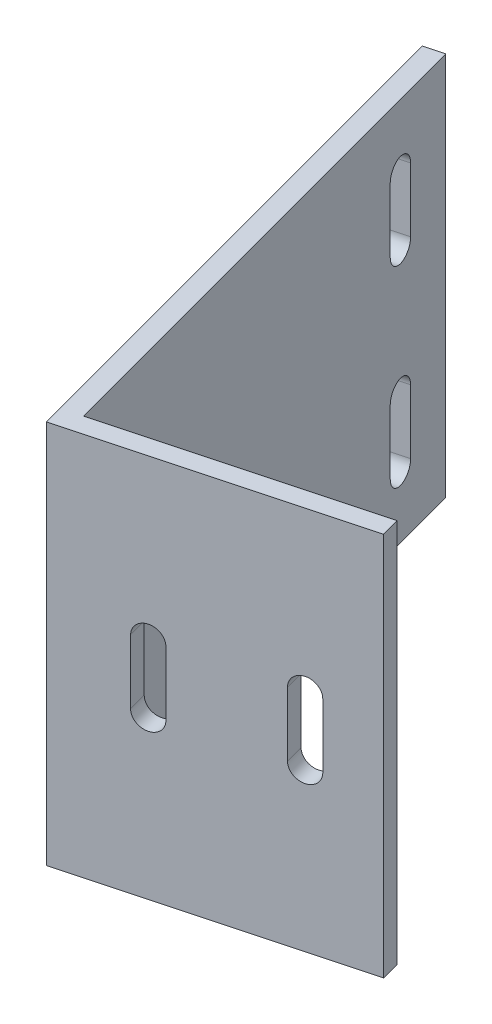
ISO-10303-21;
HEADER;
FILE_DESCRIPTION(('STEP AP214'),'2;1');
FILE_NAME('part.step','',(''),(''),'','','');
FILE_SCHEMA(('AUTOMOTIVE_DESIGN { 1 0 10303 214 1 1 1 1 }'));
ENDSEC;
DATA;
#1=APPLICATION_CONTEXT('core data for automotive mechanical design processes');
#2=APPLICATION_PROTOCOL_DEFINITION('international standard','automotive_design',2000,#1);
#3=PRODUCT_CONTEXT('',#1,'mechanical');
#4=PRODUCT('Part','Part','',(#3));
#5=PRODUCT_RELATED_PRODUCT_CATEGORY('part','',(#4));
#6=PRODUCT_DEFINITION_FORMATION('','',#4);
#7=PRODUCT_DEFINITION_CONTEXT('part definition',#1,'design');
#8=PRODUCT_DEFINITION('design','',#6,#7);
#9=PRODUCT_DEFINITION_SHAPE('','',#8);
#10=(LENGTH_UNIT() NAMED_UNIT(*) SI_UNIT(.MILLI.,.METRE.));
#11=(NAMED_UNIT(*) PLANE_ANGLE_UNIT() SI_UNIT($,.RADIAN.));
#12=(NAMED_UNIT(*) SI_UNIT($,.STERADIAN.) SOLID_ANGLE_UNIT());
#13=UNCERTAINTY_MEASURE_WITH_UNIT(LENGTH_MEASURE(1.E-05),#10,'distance_accuracy_value','');
#14=(GEOMETRIC_REPRESENTATION_CONTEXT(3) GLOBAL_UNCERTAINTY_ASSIGNED_CONTEXT((#13)) GLOBAL_UNIT_ASSIGNED_CONTEXT((#10,
#11,#12)) REPRESENTATION_CONTEXT('',''));
#15=CARTESIAN_POINT('',(0.,0.,0.));
#16=DIRECTION('',(0.,0.,1.));
#17=DIRECTION('',(1.,0.,0.));
#18=AXIS2_PLACEMENT_3D('',#15,#16,#17);
#19=CARTESIAN_POINT('',(-971.5373896003,-1784.,2948.593377713));
#20=DIRECTION('',(0.965925826288944,0.,-0.258819045102985));
#21=DIRECTION('',(0.,-1.,0.));
#22=AXIS2_PLACEMENT_3D('',#19,#20,#21);
#23=PLANE('',#22);
#24=DIRECTION('',(0.258819045102985,0.,0.965925826288944));
#25=VECTOR('',#24,1.);
#26=CARTESIAN_POINT('',(-971.5373896003,-1804.,2948.593377713));
#27=LINE('',#26,#25);
#28=CARTESIAN_POINT('',(-971.5115076958,-1804.,2948.689970295));
#29=VERTEX_POINT('',#28);
#30=CARTESIAN_POINT('',(-969.9585934252,-1804.,2954.485525253));
#31=VERTEX_POINT('',#30);
#32=EDGE_CURVE('E11',#29,#31,#27,.T.);
#33=ORIENTED_EDGE('',*,*,#32,.T.);
#34=DIRECTION('',(0.,1.,0.));
#35=VECTOR('',#34,1.);
#36=CARTESIAN_POINT('',(-969.9585934252,-1819.,2954.485525253));
#37=LINE('',#36,#35);
#38=CARTESIAN_POINT('',(-969.9585934252,-1784.,2954.485525253));
#39=VERTEX_POINT('',#38);
#40=EDGE_CURVE('E411',#31,#39,#37,.T.);
#41=ORIENTED_EDGE('',*,*,#40,.T.);
#42=DIRECTION('',(0.258819045102985,0.,0.965925826288944));
#43=VECTOR('',#42,1.);
#44=CARTESIAN_POINT('',(-971.5373896003,-1784.,2948.593377713));
#45=LINE('',#44,#43);
#46=CARTESIAN_POINT('',(-971.5115076958,-1784.,2948.689970295));
#47=VERTEX_POINT('',#46);
#48=EDGE_CURVE('E25',#47,#39,#45,.T.);
#49=ORIENTED_EDGE('',*,*,#48,.F.);
#50=DIRECTION('',(0.,1.,0.));
#51=VECTOR('',#50,1.);
#52=CARTESIAN_POINT('',(-971.5115076958,-1819.,2948.689970295));
#53=LINE('',#52,#51);
#54=EDGE_CURVE('E331',#29,#47,#53,.T.);
#55=ORIENTED_EDGE('',*,*,#54,.F.);
#56=EDGE_LOOP('',(#33,#41,#49,#55));
#57=FACE_BOUND('',#56,.T.);
#58=ADVANCED_FACE('F17',(#57),#23,.F.);
#59=CARTESIAN_POINT('',(-975.8840558186,-1804.,2949.758063416));
#60=DIRECTION('',(-0.258819045102985,0.,-0.965925826288944));
#61=DIRECTION('',(0.965925826288944,0.,-0.258819045102985));
#62=AXIS2_PLACEMENT_3D('',#59,#60,#61);
#63=CYLINDRICAL_SURFACE('',#62,4.5);
#64=DIRECTION('',(0.258819045102985,0.,0.965925826288944));
#65=VECTOR('',#64,1.);
#66=CARTESIAN_POINT('',(-980.2307220369,-1804.,2950.922749119));
#67=LINE('',#66,#65);
#68=CARTESIAN_POINT('',(-980.2048401324,-1804.,2951.019341701));
#69=VERTEX_POINT('',#68);
#70=CARTESIAN_POINT('',(-978.6519258618,-1804.,2956.814896659));
#71=VERTEX_POINT('',#70);
#72=EDGE_CURVE('E459',#69,#71,#67,.T.);
#73=ORIENTED_EDGE('',*,*,#72,.T.);
#74=CARTESIAN_POINT('',(-974.3052596435,-1804.,2955.650210956));
#75=DIRECTION('',(-0.258819045102985,0.,-0.965925826288944));
#76=DIRECTION('',(0.965925826288944,0.,-0.258819045102985));
#77=AXIS2_PLACEMENT_3D('',#74,#75,#76);
#78=CIRCLE('',#77,4.5);
#79=EDGE_CURVE('E418',#31,#71,#78,.T.);
#80=ORIENTED_EDGE('',*,*,#79,.F.);
#81=ORIENTED_EDGE('',*,*,#32,.F.);
#82=CARTESIAN_POINT('',(-975.8581739141,-1804.,2949.854655998));
#83=DIRECTION('',(-0.258819045102985,0.,-0.965925826288944));
#84=DIRECTION('',(0.965925826288944,0.,-0.258819045102985));
#85=AXIS2_PLACEMENT_3D('',#82,#83,#84);
#86=CIRCLE('',#85,4.5);
#87=EDGE_CURVE('E327',#29,#69,#86,.T.);
#88=ORIENTED_EDGE('',*,*,#87,.T.);
#89=EDGE_LOOP('',(#73,#80,#81,#88));
#90=FACE_BOUND('',#89,.T.);
#91=ADVANCED_FACE('F477',(#90),#63,.F.);
#92=CARTESIAN_POINT('',(-975.8840558186,-1784.,2949.758063416));
#93=DIRECTION('',(-0.258819045102985,0.,-0.965925826288944));
#94=DIRECTION('',(-0.965925826288944,0.,0.258819045102985));
#95=AXIS2_PLACEMENT_3D('',#92,#93,#94);
#96=CYLINDRICAL_SURFACE('',#95,4.5);
#97=ORIENTED_EDGE('',*,*,#48,.T.);
#98=CARTESIAN_POINT('',(-974.3052596435,-1784.,2955.650210956));
#99=DIRECTION('',(-0.258819045102985,0.,-0.965925826288944));
#100=DIRECTION('',(-0.965925826288944,0.,0.258819045102985));
#101=AXIS2_PLACEMENT_3D('',#98,#99,#100);
#102=CIRCLE('',#101,4.5);
#103=CARTESIAN_POINT('',(-978.6519258618,-1784.,2956.814896659));
#104=VERTEX_POINT('',#103);
#105=EDGE_CURVE('E404',#104,#39,#102,.T.);
#106=ORIENTED_EDGE('',*,*,#105,.F.);
#107=DIRECTION('',(0.258819045102985,0.,0.965925826288944));
#108=VECTOR('',#107,1.);
#109=CARTESIAN_POINT('',(-980.2307220369,-1784.,2950.922749119));
#110=LINE('',#109,#108);
#111=CARTESIAN_POINT('',(-980.2048401324,-1784.,2951.019341701));
#112=VERTEX_POINT('',#111);
#113=EDGE_CURVE('E37',#112,#104,#110,.T.);
#114=ORIENTED_EDGE('',*,*,#113,.F.);
#115=CARTESIAN_POINT('',(-975.8581739141,-1784.,2949.854655998));
#116=DIRECTION('',(-0.258819045102985,0.,-0.965925826288944));
#117=DIRECTION('',(-0.965925826288944,0.,0.258819045102985));
#118=AXIS2_PLACEMENT_3D('',#115,#116,#117);
#119=CIRCLE('',#118,4.5);
#120=EDGE_CURVE('E302',#112,#47,#119,.T.);
#121=ORIENTED_EDGE('',*,*,#120,.T.);
#122=EDGE_LOOP('',(#97,#106,#114,#121));
#123=FACE_BOUND('',#122,.T.);
#124=ADVANCED_FACE('F463',(#123),#96,.F.);
#125=CARTESIAN_POINT('',(-980.2307220369,-1804.,2950.922749119));
#126=DIRECTION('',(-0.965925826288944,0.,0.258819045102985));
#127=DIRECTION('',(0.,1.,0.));
#128=AXIS2_PLACEMENT_3D('',#125,#126,#127);
#129=PLANE('',#128);
#130=ORIENTED_EDGE('',*,*,#113,.T.);
#131=DIRECTION('',(0.,-1.,0.));
#132=VECTOR('',#131,1.);
#133=CARTESIAN_POINT('',(-978.6519258618,-1829.,2956.814896659));
#134=LINE('',#133,#132);
#135=EDGE_CURVE('E400',#104,#71,#134,.T.);
#136=ORIENTED_EDGE('',*,*,#135,.T.);
#137=ORIENTED_EDGE('',*,*,#72,.F.);
#138=DIRECTION('',(0.,-1.,0.));
#139=VECTOR('',#138,1.);
#140=CARTESIAN_POINT('',(-980.2048401324,-1829.,2951.019341701));
#141=LINE('',#140,#139);
#142=EDGE_CURVE('E297',#112,#69,#141,.T.);
#143=ORIENTED_EDGE('',*,*,#142,.F.);
#144=EDGE_LOOP('',(#130,#136,#137,#143));
#145=FACE_BOUND('',#144,.T.);
#146=ADVANCED_FACE('F472',(#145),#129,.F.);
#147=CARTESIAN_POINT('',(-937.2470227671,-1784.,2939.405301612));
#148=DIRECTION('',(-0.258819045102985,0.,-0.965925826288944));
#149=DIRECTION('',(-0.965925826288944,0.,0.258819045102985));
#150=AXIS2_PLACEMENT_3D('',#147,#148,#149);
#151=CYLINDRICAL_SURFACE('',#150,4.5);
#152=DIRECTION('',(0.258819045102985,0.,0.965925826288944));
#153=VECTOR('',#152,1.);
#154=CARTESIAN_POINT('',(-932.9003565488,-1784.,2938.240615909));
#155=LINE('',#154,#153);
#156=CARTESIAN_POINT('',(-932.8744746442,-1784.,2938.337208491));
#157=VERTEX_POINT('',#156);
#158=CARTESIAN_POINT('',(-931.3215603736,-1784.,2944.132763449));
#159=VERTEX_POINT('',#158);
#160=EDGE_CURVE('E415',#157,#159,#155,.T.);
#161=ORIENTED_EDGE('',*,*,#160,.T.);
#162=CARTESIAN_POINT('',(-935.6682265919,-1784.,2945.297449152));
#163=DIRECTION('',(-0.258819045102985,0.,-0.965925826288944));
#164=DIRECTION('',(-0.965925826288944,0.,0.258819045102985));
#165=AXIS2_PLACEMENT_3D('',#162,#163,#164);
#166=CIRCLE('',#165,4.5);
#167=CARTESIAN_POINT('',(-940.0148928102,-1784.,2946.462134855));
#168=VERTEX_POINT('',#167);
#169=EDGE_CURVE('E355',#168,#159,#166,.T.);
#170=ORIENTED_EDGE('',*,*,#169,.F.);
#171=DIRECTION('',(0.258819045102985,0.,0.965925826288944));
#172=VECTOR('',#171,1.);
#173=CARTESIAN_POINT('',(-941.5936889854,-1784.,2940.569987315));
#174=LINE('',#173,#172);
#175=CARTESIAN_POINT('',(-941.5678070808,-1784.,2940.666579897));
#176=VERTEX_POINT('',#175);
#177=EDGE_CURVE('E435',#176,#168,#174,.T.);
#178=ORIENTED_EDGE('',*,*,#177,.F.);
#179=CARTESIAN_POINT('',(-937.2211408625,-1784.,2939.501894194));
#180=DIRECTION('',(-0.258819045102985,0.,-0.965925826288944));
#181=DIRECTION('',(-0.965925826288944,0.,0.258819045102985));
#182=AXIS2_PLACEMENT_3D('',#179,#180,#181);
#183=CIRCLE('',#182,4.5);
#184=EDGE_CURVE('E372',#176,#157,#183,.T.);
#185=ORIENTED_EDGE('',*,*,#184,.T.);
#186=EDGE_LOOP('',(#161,#170,#178,#185));
#187=FACE_BOUND('',#186,.T.);
#188=ADVANCED_FACE('F489',(#187),#151,.F.);
#189=CARTESIAN_POINT('',(-932.9003565488,-1784.,2938.240615909));
#190=DIRECTION('',(0.965925826288944,0.,-0.258819045102985));
#191=DIRECTION('',(0.,-1.,0.));
#192=AXIS2_PLACEMENT_3D('',#189,#190,#191);
#193=PLANE('',#192);
#194=DIRECTION('',(0.258819045102985,0.,0.965925826288944));
#195=VECTOR('',#194,1.);
#196=CARTESIAN_POINT('',(-932.9003565488,-1804.,2938.240615909));
#197=LINE('',#196,#195);
#198=CARTESIAN_POINT('',(-932.8744746442,-1804.,2938.337208491));
#199=VERTEX_POINT('',#198);
#200=CARTESIAN_POINT('',(-931.3215603736,-1804.,2944.132763449));
#201=VERTEX_POINT('',#200);
#202=EDGE_CURVE('E412',#199,#201,#197,.T.);
#203=ORIENTED_EDGE('',*,*,#202,.T.);
#204=DIRECTION('',(0.,1.,0.));
#205=VECTOR('',#204,1.);
#206=CARTESIAN_POINT('',(-931.3215603736,-1819.,2944.132763449));
#207=LINE('',#206,#205);
#208=EDGE_CURVE('E359',#201,#159,#207,.T.);
#209=ORIENTED_EDGE('',*,*,#208,.T.);
#210=ORIENTED_EDGE('',*,*,#160,.F.);
#211=DIRECTION('',(0.,1.,0.));
#212=VECTOR('',#211,1.);
#213=CARTESIAN_POINT('',(-932.8744746442,-1819.,2938.337208491));
#214=LINE('',#213,#212);
#215=EDGE_CURVE('E368',#199,#157,#214,.T.);
#216=ORIENTED_EDGE('',*,*,#215,.F.);
#217=EDGE_LOOP('',(#203,#209,#210,#216));
#218=FACE_BOUND('',#217,.T.);
#219=ADVANCED_FACE('F492',(#218),#193,.F.);
#220=CARTESIAN_POINT('',(-937.2470227671,-1804.,2939.405301612));
#221=DIRECTION('',(-0.258819045102985,0.,-0.965925826288944));
#222=DIRECTION('',(0.965925826288944,0.,-0.258819045102985));
#223=AXIS2_PLACEMENT_3D('',#220,#221,#222);
#224=CYLINDRICAL_SURFACE('',#223,4.5);
#225=DIRECTION('',(0.258819045102985,0.,0.965925826288944));
#226=VECTOR('',#225,1.);
#227=CARTESIAN_POINT('',(-941.5936889854,-1804.,2940.569987315));
#228=LINE('',#227,#226);
#229=CARTESIAN_POINT('',(-941.5678070808,-1804.,2940.666579897));
#230=VERTEX_POINT('',#229);
#231=CARTESIAN_POINT('',(-940.0148928102,-1804.,2946.462134855));
#232=VERTEX_POINT('',#231);
#233=EDGE_CURVE('E248',#230,#232,#228,.T.);
#234=ORIENTED_EDGE('',*,*,#233,.T.);
#235=CARTESIAN_POINT('',(-935.6682265919,-1804.,2945.297449152));
#236=DIRECTION('',(-0.258819045102985,0.,-0.965925826288944));
#237=DIRECTION('',(0.965925826288944,0.,-0.258819045102985));
#238=AXIS2_PLACEMENT_3D('',#235,#236,#237);
#239=CIRCLE('',#238,4.5);
#240=EDGE_CURVE('E383',#201,#232,#239,.T.);
#241=ORIENTED_EDGE('',*,*,#240,.F.);
#242=ORIENTED_EDGE('',*,*,#202,.F.);
#243=CARTESIAN_POINT('',(-937.2211408625,-1804.,2939.501894194));
#244=DIRECTION('',(-0.258819045102985,0.,-0.965925826288944));
#245=DIRECTION('',(0.965925826288944,0.,-0.258819045102985));
#246=AXIS2_PLACEMENT_3D('',#243,#244,#245);
#247=CIRCLE('',#246,4.5);
#248=EDGE_CURVE('E373',#199,#230,#247,.T.);
#249=ORIENTED_EDGE('',*,*,#248,.T.);
#250=EDGE_LOOP('',(#234,#241,#242,#249));
#251=FACE_BOUND('',#250,.T.);
#252=ADVANCED_FACE('F496',(#251),#224,.F.);
#253=CARTESIAN_POINT('',(-941.5936889854,-1804.,2940.569987315));
#254=DIRECTION('',(-0.965925826288944,0.,0.258819045102985));
#255=DIRECTION('',(0.,1.,0.));
#256=AXIS2_PLACEMENT_3D('',#253,#254,#255);
#257=PLANE('',#256);
#258=ORIENTED_EDGE('',*,*,#177,.T.);
#259=DIRECTION('',(0.,-1.,0.));
#260=VECTOR('',#259,1.);
#261=CARTESIAN_POINT('',(-940.0148928102,-1829.,2946.462134855));
#262=LINE('',#261,#260);
#263=EDGE_CURVE('E273',#168,#232,#262,.T.);
#264=ORIENTED_EDGE('',*,*,#263,.T.);
#265=ORIENTED_EDGE('',*,*,#233,.F.);
#266=DIRECTION('',(0.,-1.,0.));
#267=VECTOR('',#266,1.);
#268=CARTESIAN_POINT('',(-941.5678070808,-1829.,2940.666579897));
#269=LINE('',#268,#267);
#270=EDGE_CURVE('E332',#176,#230,#269,.T.);
#271=ORIENTED_EDGE('',*,*,#270,.F.);
#272=EDGE_LOOP('',(#258,#264,#265,#271));
#273=FACE_BOUND('',#272,.T.);
#274=ADVANCED_FACE('F498',(#273),#257,.F.);
#275=CARTESIAN_POINT('',(-1037.303504295,-1774.,2821.380217395));
#276=DIRECTION('',(-0.965925826288944,0.,0.258819045102985));
#277=DIRECTION('',(-0.258819045102985,0.,-0.965925826288944));
#278=AXIS2_PLACEMENT_3D('',#275,#276,#277);
#279=CYLINDRICAL_SURFACE('',#278,4.5);
#280=DIRECTION('',(0.965925826288944,0.,-0.258819045102985));
#281=VECTOR('',#280,1.);
#282=CARTESIAN_POINT('',(-1036.138818592,-1774.,2825.726883613));
#283=LINE('',#282,#281);
#284=CARTESIAN_POINT('',(-1036.042226009,-1774.,2825.701001709));
#285=VERTEX_POINT('',#284);
#286=CARTESIAN_POINT('',(-1030.246671051,-1774.,2824.148087438));
#287=VERTEX_POINT('',#286);
#288=EDGE_CURVE('E448',#285,#287,#283,.T.);
#289=ORIENTED_EDGE('',*,*,#288,.T.);
#290=CARTESIAN_POINT('',(-1031.411356754,-1774.,2819.80142122));
#291=DIRECTION('',(-0.965925826288944,0.,0.258819045102985));
#292=DIRECTION('',(-0.258819045102985,0.,-0.965925826288944));
#293=AXIS2_PLACEMENT_3D('',#290,#291,#292);
#294=CIRCLE('',#293,4.5);
#295=CARTESIAN_POINT('',(-1032.576042457,-1774.,2815.454755002));
#296=VERTEX_POINT('',#295);
#297=EDGE_CURVE('E274',#296,#287,#294,.T.);
#298=ORIENTED_EDGE('',*,*,#297,.F.);
#299=DIRECTION('',(0.965925826288944,0.,-0.258819045102985));
#300=VECTOR('',#299,1.);
#301=CARTESIAN_POINT('',(-1038.468189998,-1774.,2817.033551177));
#302=LINE('',#301,#300);
#303=CARTESIAN_POINT('',(-1038.371597415,-1774.,2817.007669272));
#304=VERTEX_POINT('',#303);
#305=EDGE_CURVE('E432',#304,#296,#302,.T.);
#306=ORIENTED_EDGE('',*,*,#305,.F.);
#307=CARTESIAN_POINT('',(-1037.206911712,-1774.,2821.354335491));
#308=DIRECTION('',(-0.965925826288944,0.,0.258819045102985));
#309=DIRECTION('',(-0.258819045102985,0.,-0.965925826288944));
#310=AXIS2_PLACEMENT_3D('',#307,#308,#309);
#311=CIRCLE('',#310,4.5);
#312=EDGE_CURVE('E322',#304,#285,#311,.T.);
#313=ORIENTED_EDGE('',*,*,#312,.T.);
#314=EDGE_LOOP('',(#289,#298,#306,#313));
#315=FACE_BOUND('',#314,.T.);
#316=ADVANCED_FACE('F501',(#315),#279,.F.);
#317=CARTESIAN_POINT('',(-1038.468189998,-1754.,2817.033551177));
#318=DIRECTION('',(-0.258819045102985,0.,-0.965925826288944));
#319=DIRECTION('',(-0.965925826288944,0.,0.258819045102985));
#320=AXIS2_PLACEMENT_3D('',#317,#318,#319);
#321=PLANE('',#320);
#322=ORIENTED_EDGE('',*,*,#305,.T.);
#323=DIRECTION('',(0.,-1.,0.));
#324=VECTOR('',#323,1.);
#325=CARTESIAN_POINT('',(-1032.576042457,-1804.,2815.454755002));
#326=LINE('',#325,#324);
#327=CARTESIAN_POINT('',(-1032.576042457,-1754.,2815.454755002));
#328=VERTEX_POINT('',#327);
#329=EDGE_CURVE('E254',#328,#296,#326,.T.);
#330=ORIENTED_EDGE('',*,*,#329,.F.);
#331=DIRECTION('',(0.965925826288944,0.,-0.258819045102985));
#332=VECTOR('',#331,1.);
#333=CARTESIAN_POINT('',(-1038.468189998,-1754.,2817.033551177));
#334=LINE('',#333,#332);
#335=CARTESIAN_POINT('',(-1038.371597415,-1754.,2817.007669272));
#336=VERTEX_POINT('',#335);
#337=EDGE_CURVE('E436',#336,#328,#334,.T.);
#338=ORIENTED_EDGE('',*,*,#337,.F.);
#339=DIRECTION('',(0.,-1.,0.));
#340=VECTOR('',#339,1.);
#341=CARTESIAN_POINT('',(-1038.371597415,-1804.,2817.007669272));
#342=LINE('',#341,#340);
#343=EDGE_CURVE('E317',#336,#304,#342,.T.);
#344=ORIENTED_EDGE('',*,*,#343,.T.);
#345=EDGE_LOOP('',(#322,#330,#338,#344));
#346=FACE_BOUND('',#345,.T.);
#347=ADVANCED_FACE('F527',(#346),#321,.F.);
#348=CARTESIAN_POINT('',(-1037.303504295,-1754.,2821.380217395));
#349=DIRECTION('',(-0.965925826288944,0.,0.258819045102985));
#350=DIRECTION('',(0.258819045102985,0.,0.965925826288944));
#351=AXIS2_PLACEMENT_3D('',#348,#349,#350);
#352=CYLINDRICAL_SURFACE('',#351,4.5);
#353=ORIENTED_EDGE('',*,*,#337,.T.);
#354=CARTESIAN_POINT('',(-1031.411356754,-1754.,2819.80142122));
#355=DIRECTION('',(-0.965925826288944,0.,0.258819045102985));
#356=DIRECTION('',(0.258819045102985,0.,0.965925826288944));
#357=AXIS2_PLACEMENT_3D('',#354,#355,#356);
#358=CIRCLE('',#357,4.5);
#359=CARTESIAN_POINT('',(-1030.246671051,-1754.,2824.148087438));
#360=VERTEX_POINT('',#359);
#361=EDGE_CURVE('E250',#360,#328,#358,.T.);
#362=ORIENTED_EDGE('',*,*,#361,.F.);
#363=DIRECTION('',(0.965925826288944,0.,-0.258819045102985));
#364=VECTOR('',#363,1.);
#365=CARTESIAN_POINT('',(-1036.138818592,-1754.,2825.726883613));
#366=LINE('',#365,#364);
#367=CARTESIAN_POINT('',(-1036.042226009,-1754.,2825.701001709));
#368=VERTEX_POINT('',#367);
#369=EDGE_CURVE('E445',#368,#360,#366,.T.);
#370=ORIENTED_EDGE('',*,*,#369,.F.);
#371=CARTESIAN_POINT('',(-1037.206911712,-1754.,2821.354335491));
#372=DIRECTION('',(-0.965925826288944,0.,0.258819045102985));
#373=DIRECTION('',(0.258819045102985,0.,0.965925826288944));
#374=AXIS2_PLACEMENT_3D('',#371,#372,#373);
#375=CIRCLE('',#374,4.5);
#376=EDGE_CURVE('E321',#368,#336,#375,.T.);
#377=ORIENTED_EDGE('',*,*,#376,.T.);
#378=EDGE_LOOP('',(#353,#362,#370,#377));
#379=FACE_BOUND('',#378,.T.);
#380=ADVANCED_FACE('F507',(#379),#352,.F.);
#381=CARTESIAN_POINT('',(-1036.138818592,-1774.,2825.726883613));
#382=DIRECTION('',(0.258819045102985,0.,0.965925826288944));
#383=DIRECTION('',(0.,-1.,0.));
#384=AXIS2_PLACEMENT_3D('',#381,#382,#383);
#385=PLANE('',#384);
#386=ORIENTED_EDGE('',*,*,#369,.T.);
#387=DIRECTION('',(0.,1.,0.));
#388=VECTOR('',#387,1.);
#389=CARTESIAN_POINT('',(-1030.246671051,-1814.,2824.148087438));
#390=LINE('',#389,#388);
#391=EDGE_CURVE('E278',#287,#360,#390,.T.);
#392=ORIENTED_EDGE('',*,*,#391,.F.);
#393=ORIENTED_EDGE('',*,*,#288,.F.);
#394=DIRECTION('',(0.,1.,0.));
#395=VECTOR('',#394,1.);
#396=CARTESIAN_POINT('',(-1036.042226009,-1814.,2825.701001709));
#397=LINE('',#396,#395);
#398=EDGE_CURVE('E367',#285,#368,#397,.T.);
#399=ORIENTED_EDGE('',*,*,#398,.T.);
#400=EDGE_LOOP('',(#386,#392,#393,#399));
#401=FACE_BOUND('',#400,.T.);
#402=ADVANCED_FACE('F503',(#401),#385,.F.);
#403=CARTESIAN_POINT('',(-1038.468189998,-1814.,2817.033551177));
#404=DIRECTION('',(-0.258819045102985,0.,-0.965925826288944));
#405=DIRECTION('',(-0.965925826288944,0.,0.258819045102985));
#406=AXIS2_PLACEMENT_3D('',#403,#404,#405);
#407=PLANE('',#406);
#408=DIRECTION('',(0.965925826288944,0.,-0.258819045102985));
#409=VECTOR('',#408,1.);
#410=CARTESIAN_POINT('',(-1038.468189998,-1834.,2817.033551177));
#411=LINE('',#410,#409);
#412=CARTESIAN_POINT('',(-1038.371597415,-1834.,2817.007669272));
#413=VERTEX_POINT('',#412);
#414=CARTESIAN_POINT('',(-1032.576042457,-1834.,2815.454755002));
#415=VERTEX_POINT('',#414);
#416=EDGE_CURVE('E392',#413,#415,#411,.T.);
#417=ORIENTED_EDGE('',*,*,#416,.T.);
#418=DIRECTION('',(0.,-1.,0.));
#419=VECTOR('',#418,1.);
#420=CARTESIAN_POINT('',(-1032.576042457,-1834.,2815.454755002));
#421=LINE('',#420,#419);
#422=CARTESIAN_POINT('',(-1032.576042457,-1814.,2815.454755002));
#423=VERTEX_POINT('',#422);
#424=EDGE_CURVE('E260',#423,#415,#421,.T.);
#425=ORIENTED_EDGE('',*,*,#424,.F.);
#426=DIRECTION('',(0.965925826288944,0.,-0.258819045102985));
#427=VECTOR('',#426,1.);
#428=CARTESIAN_POINT('',(-1038.468189998,-1814.,2817.033551177));
#429=LINE('',#428,#427);
#430=CARTESIAN_POINT('',(-1038.371597415,-1814.,2817.007669272));
#431=VERTEX_POINT('',#430);
#432=EDGE_CURVE('E395',#431,#423,#429,.T.);
#433=ORIENTED_EDGE('',*,*,#432,.F.);
#434=DIRECTION('',(0.,-1.,0.));
#435=VECTOR('',#434,1.);
#436=CARTESIAN_POINT('',(-1038.371597415,-1834.,2817.007669272));
#437=LINE('',#436,#435);
#438=EDGE_CURVE('E354',#431,#413,#437,.T.);
#439=ORIENTED_EDGE('',*,*,#438,.T.);
#440=EDGE_LOOP('',(#417,#425,#433,#439));
#441=FACE_BOUND('',#440,.T.);
#442=ADVANCED_FACE('F506',(#441),#407,.F.);
#443=CARTESIAN_POINT('',(-1037.303504295,-1814.,2821.380217395));
#444=DIRECTION('',(-0.965925826288944,0.,0.258819045102985));
#445=DIRECTION('',(0.258819045102985,0.,0.965925826288944));
#446=AXIS2_PLACEMENT_3D('',#443,#444,#445);
#447=CYLINDRICAL_SURFACE('',#446,4.5);
#448=ORIENTED_EDGE('',*,*,#432,.T.);
#449=CARTESIAN_POINT('',(-1031.411356754,-1814.,2819.80142122));
#450=DIRECTION('',(-0.965925826288944,0.,0.258819045102985));
#451=DIRECTION('',(0.258819045102985,0.,0.965925826288944));
#452=AXIS2_PLACEMENT_3D('',#449,#450,#451);
#453=CIRCLE('',#452,4.5);
#454=CARTESIAN_POINT('',(-1030.246671051,-1814.,2824.148087438));
#455=VERTEX_POINT('',#454);
#456=EDGE_CURVE('E256',#455,#423,#453,.T.);
#457=ORIENTED_EDGE('',*,*,#456,.F.);
#458=DIRECTION('',(0.965925826288944,0.,-0.258819045102985));
#459=VECTOR('',#458,1.);
#460=CARTESIAN_POINT('',(-1036.138818592,-1814.,2825.726883613));
#461=LINE('',#460,#459);
#462=CARTESIAN_POINT('',(-1036.042226009,-1814.,2825.701001709));
#463=VERTEX_POINT('',#462);
#464=EDGE_CURVE('E301',#463,#455,#461,.T.);
#465=ORIENTED_EDGE('',*,*,#464,.F.);
#466=CARTESIAN_POINT('',(-1037.206911712,-1814.,2821.354335491));
#467=DIRECTION('',(-0.965925826288944,0.,0.258819045102985));
#468=DIRECTION('',(0.258819045102985,0.,0.965925826288944));
#469=AXIS2_PLACEMENT_3D('',#466,#467,#468);
#470=CIRCLE('',#469,4.5);
#471=EDGE_CURVE('E363',#463,#431,#470,.T.);
#472=ORIENTED_EDGE('',*,*,#471,.T.);
#473=EDGE_LOOP('',(#448,#457,#465,#472));
#474=FACE_BOUND('',#473,.T.);
#475=ADVANCED_FACE('F511',(#474),#447,.F.);
#476=CARTESIAN_POINT('',(-1037.303504295,-1834.,2821.380217395));
#477=DIRECTION('',(-0.965925826288944,0.,0.258819045102985));
#478=DIRECTION('',(-0.258819045102985,0.,-0.965925826288944));
#479=AXIS2_PLACEMENT_3D('',#476,#477,#478);
#480=CYLINDRICAL_SURFACE('',#479,4.5);
#481=DIRECTION('',(0.965925826288944,0.,-0.258819045102985));
#482=VECTOR('',#481,1.);
#483=CARTESIAN_POINT('',(-1036.138818592,-1834.,2825.726883613));
#484=LINE('',#483,#482);
#485=CARTESIAN_POINT('',(-1036.042226009,-1834.,2825.701001709));
#486=VERTEX_POINT('',#485);
#487=CARTESIAN_POINT('',(-1030.246671051,-1834.,2824.148087438));
#488=VERTEX_POINT('',#487);
#489=EDGE_CURVE('E396',#486,#488,#484,.T.);
#490=ORIENTED_EDGE('',*,*,#489,.T.);
#491=CARTESIAN_POINT('',(-1031.411356754,-1834.,2819.80142122));
#492=DIRECTION('',(-0.965925826288944,0.,0.258819045102985));
#493=DIRECTION('',(-0.258819045102985,0.,-0.965925826288944));
#494=AXIS2_PLACEMENT_3D('',#491,#492,#493);
#495=CIRCLE('',#494,4.5);
#496=EDGE_CURVE('E306',#415,#488,#495,.T.);
#497=ORIENTED_EDGE('',*,*,#496,.F.);
#498=ORIENTED_EDGE('',*,*,#416,.F.);
#499=CARTESIAN_POINT('',(-1037.206911712,-1834.,2821.354335491));
#500=DIRECTION('',(-0.965925826288944,0.,0.258819045102985));
#501=DIRECTION('',(-0.258819045102985,0.,-0.965925826288944));
#502=AXIS2_PLACEMENT_3D('',#499,#500,#501);
#503=CIRCLE('',#502,4.5);
#504=EDGE_CURVE('E350',#413,#486,#503,.T.);
#505=ORIENTED_EDGE('',*,*,#504,.T.);
#506=EDGE_LOOP('',(#490,#497,#498,#505));
#507=FACE_BOUND('',#506,.T.);
#508=ADVANCED_FACE('F516',(#507),#480,.F.);
#509=CARTESIAN_POINT('',(-1036.138818592,-1834.,2825.726883613));
#510=DIRECTION('',(0.258819045102985,0.,0.965925826288944));
#511=DIRECTION('',(0.,-1.,0.));
#512=AXIS2_PLACEMENT_3D('',#509,#510,#511);
#513=PLANE('',#512);
#514=ORIENTED_EDGE('',*,*,#464,.T.);
#515=DIRECTION('',(0.,1.,0.));
#516=VECTOR('',#515,1.);
#517=CARTESIAN_POINT('',(-1030.246671051,-1844.,2824.148087438));
#518=LINE('',#517,#516);
#519=EDGE_CURVE('E255',#488,#455,#518,.T.);
#520=ORIENTED_EDGE('',*,*,#519,.F.);
#521=ORIENTED_EDGE('',*,*,#489,.F.);
#522=DIRECTION('',(0.,1.,0.));
#523=VECTOR('',#522,1.);
#524=CARTESIAN_POINT('',(-1036.042226009,-1844.,2825.701001709));
#525=LINE('',#524,#523);
#526=EDGE_CURVE('E343',#486,#463,#525,.T.);
#527=ORIENTED_EDGE('',*,*,#526,.T.);
#528=EDGE_LOOP('',(#514,#520,#521,#527));
#529=FACE_BOUND('',#528,.T.);
#530=ADVANCED_FACE('F519',(#529),#513,.F.);
#531=CARTESIAN_POINT('',(-1036.587737656,-1734.,2800.482904694));
#532=DIRECTION('',(0.,1.,0.));
#533=DIRECTION('',(1.,0.,0.));
#534=AXIS2_PLACEMENT_3D('',#531,#532,#533);
#535=PLANE('',#534);
#536=DIRECTION('',(0.258819045102985,0.,0.965925826288944));
#537=VECTOR('',#536,1.);
#538=CARTESIAN_POINT('',(-1036.587737656,-1734.,2800.482904694));
#539=LINE('',#538,#537);
#540=CARTESIAN_POINT('',(-1036.587737656,-1734.,2800.482904694));
#541=VERTEX_POINT('',#540);
#542=CARTESIAN_POINT('',(-995.1766904399,-1734.,2955.031036901));
#543=VERTEX_POINT('',#542);
#544=EDGE_CURVE('E261',#541,#543,#539,.T.);
#545=ORIENTED_EDGE('',*,*,#544,.F.);
#546=DIRECTION('',(-0.965925826288944,0.,0.258819045102985));
#547=VECTOR('',#546,1.);
#548=CARTESIAN_POINT('',(-1036.587737656,-1734.,2800.482904694));
#549=LINE('',#548,#547);
#550=CARTESIAN_POINT('',(-1042.383292614,-1734.,2802.035818965));
#551=VERTEX_POINT('',#550);
#552=EDGE_CURVE('E326',#541,#551,#549,.T.);
#553=ORIENTED_EDGE('',*,*,#552,.T.);
#554=DIRECTION('',(-0.258819045102985,0.,-0.965925826288944));
#555=VECTOR('',#554,1.);
#556=CARTESIAN_POINT('',(-999.419331127,-1734.,2962.379506129));
#557=LINE('',#556,#555);
#558=CARTESIAN_POINT('',(-999.419331127,-1734.,2962.379506129));
#559=VERTEX_POINT('',#558);
#560=EDGE_CURVE('E340',#559,#551,#557,.T.);
#561=ORIENTED_EDGE('',*,*,#560,.F.);
#562=DIRECTION('',(0.965925826288944,0.,-0.258819045102985));
#563=VECTOR('',#562,1.);
#564=CARTESIAN_POINT('',(-999.419331127,-1734.,2962.379506129));
#565=LINE('',#564,#563);
#566=CARTESIAN_POINT('',(-916.3497100661,-1734.,2940.12106825));
#567=VERTEX_POINT('',#566);
#568=EDGE_CURVE('E269',#559,#567,#565,.T.);
#569=ORIENTED_EDGE('',*,*,#568,.T.);
#570=DIRECTION('',(0.258819045102985,0.,0.965925826288944));
#571=VECTOR('',#570,1.);
#572=CARTESIAN_POINT('',(-917.9026243368,-1734.,2934.325513292));
#573=LINE('',#572,#571);
#574=CARTESIAN_POINT('',(-917.9026243368,-1734.,2934.325513292));
#575=VERTEX_POINT('',#574);
#576=EDGE_CURVE('E225',#575,#567,#573,.T.);
#577=ORIENTED_EDGE('',*,*,#576,.F.);
#578=DIRECTION('',(-0.965925826288944,0.,0.258819045102985));
#579=VECTOR('',#578,1.);
#580=CARTESIAN_POINT('',(-917.9026243368,-1734.,2934.325513292));
#581=LINE('',#580,#579);
#582=EDGE_CURVE('E221',#575,#543,#581,.T.);
#583=ORIENTED_EDGE('',*,*,#582,.T.);
#584=EDGE_LOOP('',(#545,#553,#561,#569,#577,#583));
#585=FACE_BOUND('',#584,.T.);
#586=ADVANCED_FACE('F521',(#585),#535,.T.);
#587=CARTESIAN_POINT('',(-917.9026243368,-1854.,2934.325513292));
#588=DIRECTION('',(0.258819045102985,0.,0.965925826288944));
#589=DIRECTION('',(0.,-1.,0.));
#590=AXIS2_PLACEMENT_3D('',#587,#588,#589);
#591=PLANE('',#590);
#592=ORIENTED_EDGE('',*,*,#87,.F.);
#593=ORIENTED_EDGE('',*,*,#54,.T.);
#594=ORIENTED_EDGE('',*,*,#120,.F.);
#595=ORIENTED_EDGE('',*,*,#142,.T.);
#596=EDGE_LOOP('',(#592,#593,#594,#595));
#597=FACE_BOUND('',#596,.T.);
#598=ORIENTED_EDGE('',*,*,#248,.F.);
#599=ORIENTED_EDGE('',*,*,#215,.T.);
#600=ORIENTED_EDGE('',*,*,#184,.F.);
#601=ORIENTED_EDGE('',*,*,#270,.T.);
#602=EDGE_LOOP('',(#598,#599,#600,#601));
#603=FACE_BOUND('',#602,.T.);
#604=DIRECTION('',(0.,1.,0.));
#605=VECTOR('',#604,1.);
#606=CARTESIAN_POINT('',(-995.1766904399,-1854.,2955.031036901));
#607=LINE('',#606,#605);
#608=CARTESIAN_POINT('',(-995.1766904399,-1854.,2955.031036901));
#609=VERTEX_POINT('',#608);
#610=EDGE_CURVE('E264',#609,#543,#607,.T.);
#611=ORIENTED_EDGE('',*,*,#610,.T.);
#612=ORIENTED_EDGE('',*,*,#582,.F.);
#613=DIRECTION('',(0.,1.,0.));
#614=VECTOR('',#613,1.);
#615=CARTESIAN_POINT('',(-917.9026243368,-1854.,2934.325513292));
#616=LINE('',#615,#614);
#617=CARTESIAN_POINT('',(-917.9026243368,-1854.,2934.325513292));
#618=VERTEX_POINT('',#617);
#619=EDGE_CURVE('E215',#618,#575,#616,.T.);
#620=ORIENTED_EDGE('',*,*,#619,.F.);
#621=DIRECTION('',(-0.965925826288944,0.,0.258819045102985));
#622=VECTOR('',#621,1.);
#623=CARTESIAN_POINT('',(-917.9026243368,-1854.,2934.325513292));
#624=LINE('',#623,#622);
#625=EDGE_CURVE('E220',#618,#609,#624,.T.);
#626=ORIENTED_EDGE('',*,*,#625,.T.);
#627=EDGE_LOOP('',(#611,#612,#620,#626));
#628=FACE_BOUND('',#627,.T.);
#629=ADVANCED_FACE('F218',(#597,#603,#628),#591,.F.);
#630=CARTESIAN_POINT('',(-917.9026243368,-1854.,2934.325513292));
#631=DIRECTION('',(-0.965925826288944,0.,0.258819045102985));
#632=DIRECTION('',(0.,1.,0.));
#633=AXIS2_PLACEMENT_3D('',#630,#631,#632);
#634=PLANE('',#633);
#635=ORIENTED_EDGE('',*,*,#576,.T.);
#636=DIRECTION('',(0.,1.,0.));
#637=VECTOR('',#636,1.);
#638=CARTESIAN_POINT('',(-916.3497100661,-1854.,2940.12106825));
#639=LINE('',#638,#637);
#640=CARTESIAN_POINT('',(-916.3497100661,-1854.,2940.12106825));
#641=VERTEX_POINT('',#640);
#642=EDGE_CURVE('E231',#641,#567,#639,.T.);
#643=ORIENTED_EDGE('',*,*,#642,.F.);
#644=DIRECTION('',(0.258819045102985,0.,0.965925826288944));
#645=VECTOR('',#644,1.);
#646=CARTESIAN_POINT('',(-917.9026243368,-1854.,2934.325513292));
#647=LINE('',#646,#645);
#648=EDGE_CURVE('E228',#618,#641,#647,.T.);
#649=ORIENTED_EDGE('',*,*,#648,.F.);
#650=ORIENTED_EDGE('',*,*,#619,.T.);
#651=EDGE_LOOP('',(#635,#643,#649,#650));
#652=FACE_BOUND('',#651,.T.);
#653=ADVANCED_FACE('F229',(#652),#634,.F.);
#654=CARTESIAN_POINT('',(-993.6237761693,-1854.,2960.826591858));
#655=DIRECTION('',(0.258819045102985,0.,0.965925826288944));
#656=DIRECTION('',(0.,-1.,0.));
#657=AXIS2_PLACEMENT_3D('',#654,#655,#656);
#658=PLANE('',#657);
#659=ORIENTED_EDGE('',*,*,#135,.F.);
#660=ORIENTED_EDGE('',*,*,#105,.T.);
#661=ORIENTED_EDGE('',*,*,#40,.F.);
#662=ORIENTED_EDGE('',*,*,#79,.T.);
#663=EDGE_LOOP('',(#659,#660,#661,#662));
#664=FACE_BOUND('',#663,.T.);
#665=ORIENTED_EDGE('',*,*,#263,.F.);
#666=ORIENTED_EDGE('',*,*,#169,.T.);
#667=ORIENTED_EDGE('',*,*,#208,.F.);
#668=ORIENTED_EDGE('',*,*,#240,.T.);
#669=EDGE_LOOP('',(#665,#666,#667,#668));
#670=FACE_BOUND('',#669,.T.);
#671=DIRECTION('',(-0.965925826288944,0.,0.258819045102985));
#672=VECTOR('',#671,1.);
#673=CARTESIAN_POINT('',(-916.3497100661,-1854.,2940.12106825));
#674=LINE('',#673,#672);
#675=CARTESIAN_POINT('',(-999.419331127,-1854.,2962.379506129));
#676=VERTEX_POINT('',#675);
#677=EDGE_CURVE('E236',#641,#676,#674,.T.);
#678=ORIENTED_EDGE('',*,*,#677,.F.);
#679=ORIENTED_EDGE('',*,*,#642,.T.);
#680=ORIENTED_EDGE('',*,*,#568,.F.);
#681=DIRECTION('',(0.,1.,0.));
#682=VECTOR('',#681,1.);
#683=CARTESIAN_POINT('',(-999.419331127,-1854.,2962.379506129));
#684=LINE('',#683,#682);
#685=EDGE_CURVE('E336',#676,#559,#684,.T.);
#686=ORIENTED_EDGE('',*,*,#685,.F.);
#687=EDGE_LOOP('',(#678,#679,#680,#686));
#688=FACE_BOUND('',#687,.T.);
#689=ADVANCED_FACE('F469',(#664,#670,#688),#658,.T.);
#690=CARTESIAN_POINT('',(-1042.383292614,-1854.,2802.035818965));
#691=DIRECTION('',(-0.965925826288944,0.,0.258819045102985));
#692=DIRECTION('',(0.,1.,0.));
#693=AXIS2_PLACEMENT_3D('',#690,#691,#692);
#694=PLANE('',#693);
#695=ORIENTED_EDGE('',*,*,#398,.F.);
#696=ORIENTED_EDGE('',*,*,#312,.F.);
#697=ORIENTED_EDGE('',*,*,#343,.F.);
#698=ORIENTED_EDGE('',*,*,#376,.F.);
#699=EDGE_LOOP('',(#695,#696,#697,#698));
#700=FACE_BOUND('',#699,.T.);
#701=ORIENTED_EDGE('',*,*,#526,.F.);
#702=ORIENTED_EDGE('',*,*,#504,.F.);
#703=ORIENTED_EDGE('',*,*,#438,.F.);
#704=ORIENTED_EDGE('',*,*,#471,.F.);
#705=EDGE_LOOP('',(#701,#702,#703,#704));
#706=FACE_BOUND('',#705,.T.);
#707=DIRECTION('',(0.,1.,0.));
#708=VECTOR('',#707,1.);
#709=CARTESIAN_POINT('',(-1042.383292614,-1854.,2802.035818965));
#710=LINE('',#709,#708);
#711=CARTESIAN_POINT('',(-1042.383292614,-1854.,2802.035818965));
#712=VERTEX_POINT('',#711);
#713=EDGE_CURVE('E316',#712,#551,#710,.T.);
#714=ORIENTED_EDGE('',*,*,#713,.F.);
#715=DIRECTION('',(-0.258819045102985,0.,-0.965925826288944));
#716=VECTOR('',#715,1.);
#717=CARTESIAN_POINT('',(-999.419331127,-1854.,2962.379506129));
#718=LINE('',#717,#716);
#719=EDGE_CURVE('E268',#676,#712,#718,.T.);
#720=ORIENTED_EDGE('',*,*,#719,.F.);
#721=ORIENTED_EDGE('',*,*,#685,.T.);
#722=ORIENTED_EDGE('',*,*,#560,.T.);
#723=EDGE_LOOP('',(#714,#720,#721,#722));
#724=FACE_BOUND('',#723,.T.);
#725=ADVANCED_FACE('F542',(#700,#706,#724),#694,.T.);
#726=CARTESIAN_POINT('',(-1036.587737656,-1854.,2800.482904694));
#727=DIRECTION('',(0.258819045102985,0.,0.965925826288944));
#728=DIRECTION('',(0.,-1.,0.));
#729=AXIS2_PLACEMENT_3D('',#726,#727,#728);
#730=PLANE('',#729);
#731=ORIENTED_EDGE('',*,*,#713,.T.);
#732=ORIENTED_EDGE('',*,*,#552,.F.);
#733=DIRECTION('',(0.,1.,0.));
#734=VECTOR('',#733,1.);
#735=CARTESIAN_POINT('',(-1036.587737656,-1854.,2800.482904694));
#736=LINE('',#735,#734);
#737=CARTESIAN_POINT('',(-1036.587737656,-1854.,2800.482904694));
#738=VERTEX_POINT('',#737);
#739=EDGE_CURVE('E287',#738,#541,#736,.T.);
#740=ORIENTED_EDGE('',*,*,#739,.F.);
#741=DIRECTION('',(-0.965925826288944,0.,0.258819045102985));
#742=VECTOR('',#741,1.);
#743=CARTESIAN_POINT('',(-1036.587737656,-1854.,2800.482904694));
#744=LINE('',#743,#742);
#745=EDGE_CURVE('E265',#738,#712,#744,.T.);
#746=ORIENTED_EDGE('',*,*,#745,.T.);
#747=EDGE_LOOP('',(#731,#732,#740,#746));
#748=FACE_BOUND('',#747,.T.);
#749=ADVANCED_FACE('F545',(#748),#730,.F.);
#750=CARTESIAN_POINT('',(-1036.587737656,-1854.,2800.482904694));
#751=DIRECTION('',(-0.965925826288944,0.,0.258819045102985));
#752=DIRECTION('',(0.,1.,0.));
#753=AXIS2_PLACEMENT_3D('',#750,#751,#752);
#754=PLANE('',#753);
#755=ORIENTED_EDGE('',*,*,#361,.T.);
#756=ORIENTED_EDGE('',*,*,#329,.T.);
#757=ORIENTED_EDGE('',*,*,#297,.T.);
#758=ORIENTED_EDGE('',*,*,#391,.T.);
#759=EDGE_LOOP('',(#755,#756,#757,#758));
#760=FACE_BOUND('',#759,.T.);
#761=ORIENTED_EDGE('',*,*,#456,.T.);
#762=ORIENTED_EDGE('',*,*,#424,.T.);
#763=ORIENTED_EDGE('',*,*,#496,.T.);
#764=ORIENTED_EDGE('',*,*,#519,.T.);
#765=EDGE_LOOP('',(#761,#762,#763,#764));
#766=FACE_BOUND('',#765,.T.);
#767=ORIENTED_EDGE('',*,*,#610,.F.);
#768=DIRECTION('',(0.258819045102985,0.,0.965925826288944));
#769=VECTOR('',#768,1.);
#770=CARTESIAN_POINT('',(-1036.587737656,-1854.,2800.482904694));
#771=LINE('',#770,#769);
#772=EDGE_CURVE('E242',#738,#609,#771,.T.);
#773=ORIENTED_EDGE('',*,*,#772,.F.);
#774=ORIENTED_EDGE('',*,*,#739,.T.);
#775=ORIENTED_EDGE('',*,*,#544,.T.);
#776=EDGE_LOOP('',(#767,#773,#774,#775));
#777=FACE_BOUND('',#776,.T.);
#778=ADVANCED_FACE('F551',(#760,#766,#777),#754,.F.);
#779=CARTESIAN_POINT('',(-1036.587737656,-1854.,2800.482904694));
#780=DIRECTION('',(0.,1.,0.));
#781=DIRECTION('',(1.,0.,0.));
#782=AXIS2_PLACEMENT_3D('',#779,#780,#781);
#783=PLANE('',#782);
#784=ORIENTED_EDGE('',*,*,#625,.F.);
#785=ORIENTED_EDGE('',*,*,#648,.T.);
#786=ORIENTED_EDGE('',*,*,#677,.T.);
#787=ORIENTED_EDGE('',*,*,#719,.T.);
#788=ORIENTED_EDGE('',*,*,#745,.F.);
#789=ORIENTED_EDGE('',*,*,#772,.T.);
#790=EDGE_LOOP('',(#784,#785,#786,#787,#788,#789));
#791=FACE_BOUND('',#790,.T.);
#792=ADVANCED_FACE('F239',(#791),#783,.F.);
#793=CLOSED_SHELL('',(#58,#91,#124,#146,#188,#219,#252,#274,#316,#347,#380,#402,#442,#475,#508,
#530,#586,#629,#653,#689,#725,#749,#778,#792));
#794=MANIFOLD_SOLID_BREP('B1',#793);
#795=ADVANCED_BREP_SHAPE_REPRESENTATION('',(#18,#794),#14);
#796=SHAPE_DEFINITION_REPRESENTATION(#9,#795);
ENDSEC;
END-ISO-10303-21;
